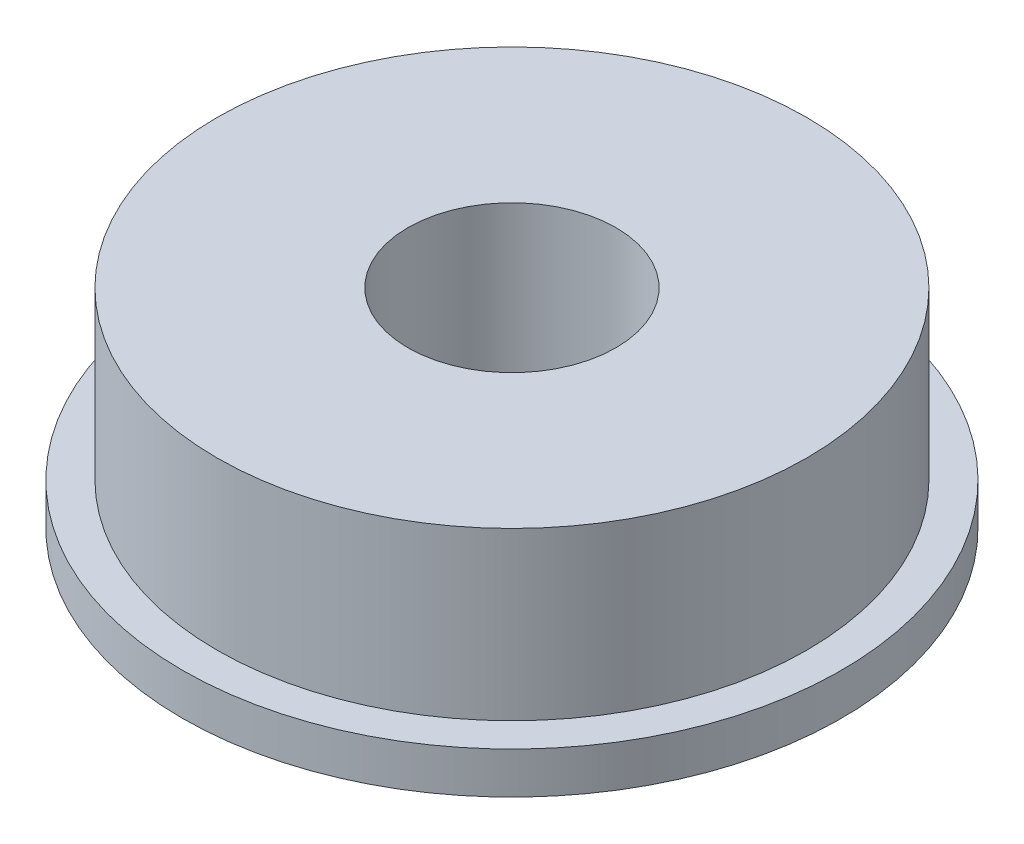
ISO-10303-21;
HEADER;
FILE_DESCRIPTION(('STEP AP214'),'2;1');
FILE_NAME('part.step','',(''),(''),'','','');
FILE_SCHEMA(('AUTOMOTIVE_DESIGN { 1 0 10303 214 1 1 1 1 }'));
ENDSEC;
DATA;
#1=APPLICATION_CONTEXT('core data for automotive mechanical design processes');
#2=APPLICATION_PROTOCOL_DEFINITION('international standard','automotive_design',2000,#1);
#3=PRODUCT_CONTEXT('',#1,'mechanical');
#4=PRODUCT('Part','Part','',(#3));
#5=PRODUCT_RELATED_PRODUCT_CATEGORY('part','',(#4));
#6=PRODUCT_DEFINITION_FORMATION('','',#4);
#7=PRODUCT_DEFINITION_CONTEXT('part definition',#1,'design');
#8=PRODUCT_DEFINITION('design','',#6,#7);
#9=PRODUCT_DEFINITION_SHAPE('','',#8);
#10=(LENGTH_UNIT() NAMED_UNIT(*) SI_UNIT(.MILLI.,.METRE.));
#11=(NAMED_UNIT(*) PLANE_ANGLE_UNIT() SI_UNIT($,.RADIAN.));
#12=(NAMED_UNIT(*) SI_UNIT($,.STERADIAN.) SOLID_ANGLE_UNIT());
#13=UNCERTAINTY_MEASURE_WITH_UNIT(LENGTH_MEASURE(1.E-05),#10,'distance_accuracy_value','');
#14=(GEOMETRIC_REPRESENTATION_CONTEXT(3) GLOBAL_UNCERTAINTY_ASSIGNED_CONTEXT((#13)) GLOBAL_UNIT_ASSIGNED_CONTEXT((#10,
#11,#12)) REPRESENTATION_CONTEXT('',''));
#15=CARTESIAN_POINT('',(0.,0.,0.));
#16=DIRECTION('',(0.,0.,1.));
#17=DIRECTION('',(1.,0.,0.));
#18=AXIS2_PLACEMENT_3D('',#15,#16,#17);
#19=CARTESIAN_POINT('',(0.,1.2,0.));
#20=DIRECTION('',(0.,-1.,0.));
#21=DIRECTION('',(0.,0.,-1.));
#22=AXIS2_PLACEMENT_3D('',#19,#20,#21);
#23=CYLINDRICAL_SURFACE('',#22,9.5);
#24=CARTESIAN_POINT('',(0.,1.2,0.));
#25=DIRECTION('',(0.,1.,0.));
#26=DIRECTION('',(0.,0.,1.));
#27=AXIS2_PLACEMENT_3D('',#24,#25,#26);
#28=CIRCLE('',#27,9.5);
#29=CARTESIAN_POINT('',(0.,1.2,9.5));
#30=VERTEX_POINT('',#29);
#31=EDGE_CURVE('E46',#30,#30,#28,.T.);
#32=ORIENTED_EDGE('',*,*,#31,.F.);
#33=EDGE_LOOP('',(#32));
#34=FACE_BOUND('',#33,.T.);
#35=CARTESIAN_POINT('',(0.,0.,0.));
#36=DIRECTION('',(0.,1.,0.));
#37=DIRECTION('',(0.,0.,1.));
#38=AXIS2_PLACEMENT_3D('',#35,#36,#37);
#39=CIRCLE('',#38,9.5);
#40=CARTESIAN_POINT('',(0.,0.,9.5));
#41=VERTEX_POINT('',#40);
#42=EDGE_CURVE('E45',#41,#41,#39,.T.);
#43=ORIENTED_EDGE('',*,*,#42,.T.);
#44=EDGE_LOOP('',(#43));
#45=FACE_BOUND('',#44,.T.);
#46=ADVANCED_FACE('F39',(#34,#45),#23,.T.);
#47=CARTESIAN_POINT('',(0.,1.2,0.));
#48=DIRECTION('',(0.,1.,0.));
#49=DIRECTION('',(0.,0.,1.));
#50=AXIS2_PLACEMENT_3D('',#47,#48,#49);
#51=PLANE('',#50);
#52=CARTESIAN_POINT('',(0.,1.2,0.));
#53=DIRECTION('',(0.,1.,0.));
#54=DIRECTION('',(0.,0.,1.));
#55=AXIS2_PLACEMENT_3D('',#52,#53,#54);
#56=CIRCLE('',#55,8.5);
#57=CARTESIAN_POINT('',(0.,1.2,8.5));
#58=VERTEX_POINT('',#57);
#59=EDGE_CURVE('E10',#58,#58,#56,.T.);
#60=ORIENTED_EDGE('',*,*,#59,.F.);
#61=EDGE_LOOP('',(#60));
#62=FACE_BOUND('',#61,.T.);
#63=ORIENTED_EDGE('',*,*,#31,.T.);
#64=EDGE_LOOP('',(#63));
#65=FACE_BOUND('',#64,.T.);
#66=ADVANCED_FACE('F79',(#62,#65),#51,.T.);
#67=CARTESIAN_POINT('',(0.,0.,0.));
#68=DIRECTION('',(0.,1.,0.));
#69=DIRECTION('',(0.,0.,1.));
#70=AXIS2_PLACEMENT_3D('',#67,#68,#69);
#71=PLANE('',#70);
#72=CARTESIAN_POINT('',(0.,0.,0.));
#73=DIRECTION('',(0.,1.,0.));
#74=DIRECTION('',(0.,0.,1.));
#75=AXIS2_PLACEMENT_3D('',#72,#73,#74);
#76=CIRCLE('',#75,3.);
#77=CARTESIAN_POINT('',(0.,0.,3.));
#78=VERTEX_POINT('',#77);
#79=EDGE_CURVE('E54',#78,#78,#76,.T.);
#80=ORIENTED_EDGE('',*,*,#79,.T.);
#81=EDGE_LOOP('',(#80));
#82=FACE_BOUND('',#81,.T.);
#83=ORIENTED_EDGE('',*,*,#42,.F.);
#84=EDGE_LOOP('',(#83));
#85=FACE_BOUND('',#84,.T.);
#86=ADVANCED_FACE('F71',(#82,#85),#71,.F.);
#87=CARTESIAN_POINT('',(0.,6.,0.));
#88=DIRECTION('',(0.,-1.,0.));
#89=DIRECTION('',(0.,0.,-1.));
#90=AXIS2_PLACEMENT_3D('',#87,#88,#89);
#91=CYLINDRICAL_SURFACE('',#90,8.5);
#92=CARTESIAN_POINT('',(0.,6.,0.));
#93=DIRECTION('',(0.,1.,0.));
#94=DIRECTION('',(0.,0.,1.));
#95=AXIS2_PLACEMENT_3D('',#92,#93,#94);
#96=CIRCLE('',#95,8.5);
#97=CARTESIAN_POINT('',(0.,6.,8.5));
#98=VERTEX_POINT('',#97);
#99=EDGE_CURVE('E55',#98,#98,#96,.T.);
#100=ORIENTED_EDGE('',*,*,#99,.F.);
#101=EDGE_LOOP('',(#100));
#102=FACE_BOUND('',#101,.T.);
#103=ORIENTED_EDGE('',*,*,#59,.T.);
#104=EDGE_LOOP('',(#103));
#105=FACE_BOUND('',#104,.T.);
#106=ADVANCED_FACE('F67',(#102,#105),#91,.T.);
#107=CARTESIAN_POINT('',(0.,6.,0.));
#108=DIRECTION('',(0.,1.,0.));
#109=DIRECTION('',(0.,0.,1.));
#110=AXIS2_PLACEMENT_3D('',#107,#108,#109);
#111=PLANE('',#110);
#112=CARTESIAN_POINT('',(0.,6.,0.));
#113=DIRECTION('',(0.,1.,0.));
#114=DIRECTION('',(0.,0.,1.));
#115=AXIS2_PLACEMENT_3D('',#112,#113,#114);
#116=CIRCLE('',#115,3.);
#117=CARTESIAN_POINT('',(0.,6.,3.));
#118=VERTEX_POINT('',#117);
#119=EDGE_CURVE('E59',#118,#118,#116,.T.);
#120=ORIENTED_EDGE('',*,*,#119,.F.);
#121=EDGE_LOOP('',(#120));
#122=FACE_BOUND('',#121,.T.);
#123=ORIENTED_EDGE('',*,*,#99,.T.);
#124=EDGE_LOOP('',(#123));
#125=FACE_BOUND('',#124,.T.);
#126=ADVANCED_FACE('F62',(#122,#125),#111,.T.);
#127=CARTESIAN_POINT('',(0.,-14.,0.));
#128=DIRECTION('',(0.,1.,0.));
#129=DIRECTION('',(0.,0.,1.));
#130=AXIS2_PLACEMENT_3D('',#127,#128,#129);
#131=CYLINDRICAL_SURFACE('',#130,3.);
#132=ORIENTED_EDGE('',*,*,#119,.T.);
#133=EDGE_LOOP('',(#132));
#134=FACE_BOUND('',#133,.T.);
#135=ORIENTED_EDGE('',*,*,#79,.F.);
#136=EDGE_LOOP('',(#135));
#137=FACE_BOUND('',#136,.T.);
#138=ADVANCED_FACE('F65',(#134,#137),#131,.F.);
#139=CLOSED_SHELL('',(#46,#66,#86,#106,#126,#138));
#140=MANIFOLD_SOLID_BREP('B2',#139);
#141=ADVANCED_BREP_SHAPE_REPRESENTATION('',(#18,#140),#14);
#142=SHAPE_DEFINITION_REPRESENTATION(#9,#141);
ENDSEC;
END-ISO-10303-21;
